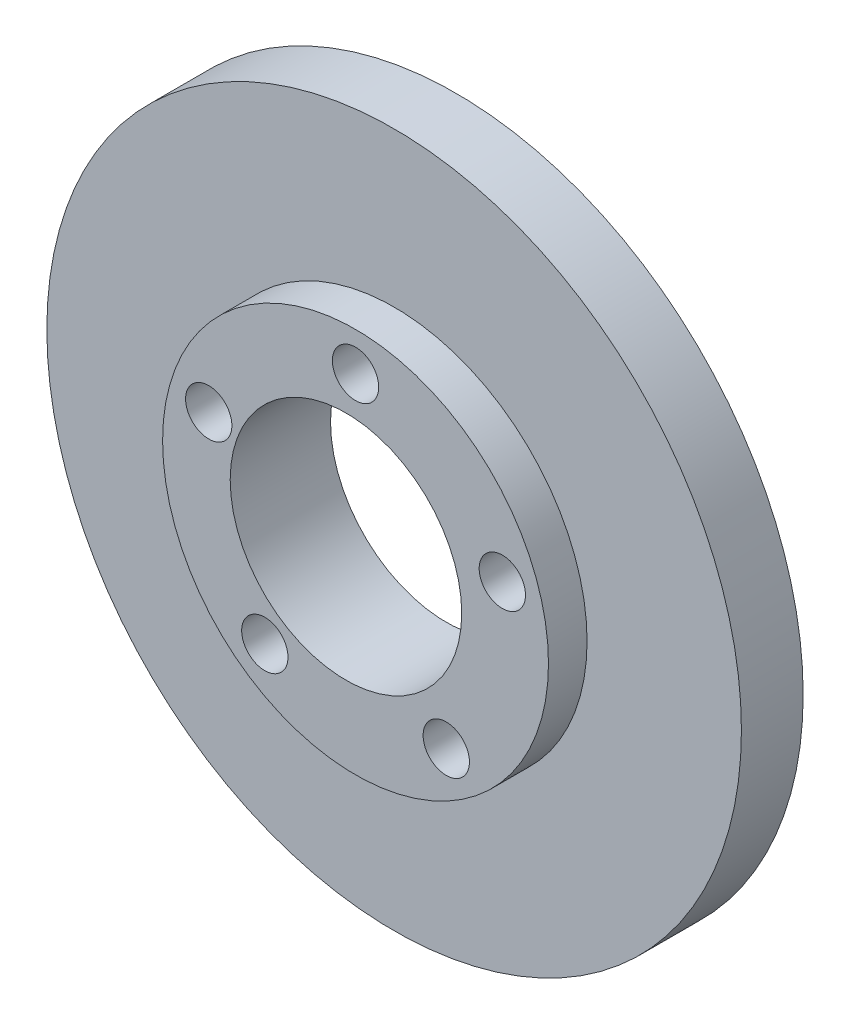
ISO-10303-21;
HEADER;
FILE_DESCRIPTION(('STEP AP214'),'2;1');
FILE_NAME('part.step','',(''),(''),'','','');
FILE_SCHEMA(('AUTOMOTIVE_DESIGN { 1 0 10303 214 1 1 1 1 }'));
ENDSEC;
DATA;
#1=APPLICATION_CONTEXT('core data for automotive mechanical design processes');
#2=APPLICATION_PROTOCOL_DEFINITION('international standard','automotive_design',2000,#1);
#3=PRODUCT_CONTEXT('',#1,'mechanical');
#4=PRODUCT('Part','Part','',(#3));
#5=PRODUCT_RELATED_PRODUCT_CATEGORY('part','',(#4));
#6=PRODUCT_DEFINITION_FORMATION('','',#4);
#7=PRODUCT_DEFINITION_CONTEXT('part definition',#1,'design');
#8=PRODUCT_DEFINITION('design','',#6,#7);
#9=PRODUCT_DEFINITION_SHAPE('','',#8);
#10=(LENGTH_UNIT() NAMED_UNIT(*) SI_UNIT(.MILLI.,.METRE.));
#11=(NAMED_UNIT(*) PLANE_ANGLE_UNIT() SI_UNIT($,.RADIAN.));
#12=(NAMED_UNIT(*) SI_UNIT($,.STERADIAN.) SOLID_ANGLE_UNIT());
#13=UNCERTAINTY_MEASURE_WITH_UNIT(LENGTH_MEASURE(1.E-05),#10,'distance_accuracy_value','');
#14=(GEOMETRIC_REPRESENTATION_CONTEXT(3) GLOBAL_UNCERTAINTY_ASSIGNED_CONTEXT((#13)) GLOBAL_UNIT_ASSIGNED_CONTEXT((#10,
#11,#12)) REPRESENTATION_CONTEXT('',''));
#15=CARTESIAN_POINT('',(0.,0.,0.));
#16=DIRECTION('',(0.,0.,1.));
#17=DIRECTION('',(1.,0.,0.));
#18=AXIS2_PLACEMENT_3D('',#15,#16,#17);
#19=CARTESIAN_POINT('',(0.,0.,8.));
#20=DIRECTION('',(0.,0.,1.));
#21=DIRECTION('',(1.,0.,0.));
#22=AXIS2_PLACEMENT_3D('',#19,#20,#21);
#23=PLANE('',#22);
#24=CARTESIAN_POINT('',(0.,0.,8.));
#25=DIRECTION('',(0.,0.,1.));
#26=DIRECTION('',(1.,0.,0.));
#27=AXIS2_PLACEMENT_3D('',#24,#25,#26);
#28=CIRCLE('',#27,90.);
#29=CARTESIAN_POINT('',(90.,0.,8.));
#30=VERTEX_POINT('',#29);
#31=EDGE_CURVE('E10',#30,#30,#28,.T.);
#32=ORIENTED_EDGE('',*,*,#31,.T.);
#33=EDGE_LOOP('',(#32));
#34=FACE_BOUND('',#33,.T.);
#35=CARTESIAN_POINT('',(0.,0.,8.));
#36=DIRECTION('',(0.,0.,1.));
#37=DIRECTION('',(1.,0.,0.));
#38=AXIS2_PLACEMENT_3D('',#35,#36,#37);
#39=CIRCLE('',#38,50.);
#40=CARTESIAN_POINT('',(50.,0.,8.));
#41=VERTEX_POINT('',#40);
#42=EDGE_CURVE('E56',#41,#41,#39,.T.);
#43=ORIENTED_EDGE('',*,*,#42,.F.);
#44=EDGE_LOOP('',(#43));
#45=FACE_BOUND('',#44,.T.);
#46=ADVANCED_FACE('F37',(#34,#45),#23,.T.);
#47=CARTESIAN_POINT('',(0.,0.,-8.));
#48=DIRECTION('',(0.,0.,1.));
#49=DIRECTION('',(1.,0.,0.));
#50=AXIS2_PLACEMENT_3D('',#47,#48,#49);
#51=PLANE('',#50);
#52=CARTESIAN_POINT('',(0.,40.,-8.));
#53=DIRECTION('',(0.,0.,1.));
#54=DIRECTION('',(1.,0.,0.));
#55=AXIS2_PLACEMENT_3D('',#52,#53,#54);
#56=CIRCLE('',#55,6.);
#57=CARTESIAN_POINT('',(6.,40.,-8.));
#58=VERTEX_POINT('',#57);
#59=EDGE_CURVE('E99',#58,#58,#56,.T.);
#60=ORIENTED_EDGE('',*,*,#59,.T.);
#61=EDGE_LOOP('',(#60));
#62=FACE_BOUND('',#61,.T.);
#63=CARTESIAN_POINT('',(-38.042260651805,12.3606797749963,-8.));
#64=DIRECTION('',(0.,0.,1.));
#65=DIRECTION('',(1.,0.,0.));
#66=AXIS2_PLACEMENT_3D('',#63,#64,#65);
#67=CIRCLE('',#66,6.);
#68=CARTESIAN_POINT('',(-32.042260651805,12.3606797749963,-8.));
#69=VERTEX_POINT('',#68);
#70=EDGE_CURVE('E91',#69,#69,#67,.T.);
#71=ORIENTED_EDGE('',*,*,#70,.T.);
#72=EDGE_LOOP('',(#71));
#73=FACE_BOUND('',#72,.T.);
#74=CARTESIAN_POINT('',(-23.5114100916959,-32.3606797749989,-8.));
#75=DIRECTION('',(0.,0.,1.));
#76=DIRECTION('',(1.,0.,0.));
#77=AXIS2_PLACEMENT_3D('',#74,#75,#76);
#78=CIRCLE('',#77,5.99999999999999);
#79=CARTESIAN_POINT('',(-17.5114100916959,-32.3606797749989,-8.));
#80=VERTEX_POINT('',#79);
#81=EDGE_CURVE('E83',#80,#80,#78,.T.);
#82=ORIENTED_EDGE('',*,*,#81,.T.);
#83=EDGE_LOOP('',(#82));
#84=FACE_BOUND('',#83,.T.);
#85=CARTESIAN_POINT('',(23.511410091702,-32.3606797749969,-8.));
#86=DIRECTION('',(0.,0.,1.));
#87=DIRECTION('',(1.,0.,0.));
#88=AXIS2_PLACEMENT_3D('',#85,#86,#87);
#89=CIRCLE('',#88,5.99999999999999);
#90=CARTESIAN_POINT('',(29.511410091702,-32.3606797749969,-8.));
#91=VERTEX_POINT('',#90);
#92=EDGE_CURVE('E75',#91,#91,#89,.T.);
#93=ORIENTED_EDGE('',*,*,#92,.T.);
#94=EDGE_LOOP('',(#93));
#95=FACE_BOUND('',#94,.T.);
#96=CARTESIAN_POINT('',(38.0422606518073,12.3606797749995,-8.));
#97=DIRECTION('',(0.,0.,1.));
#98=DIRECTION('',(1.,0.,0.));
#99=AXIS2_PLACEMENT_3D('',#96,#97,#98);
#100=CIRCLE('',#99,6.);
#101=CARTESIAN_POINT('',(44.0422606518073,12.3606797749995,-8.));
#102=VERTEX_POINT('',#101);
#103=EDGE_CURVE('E67',#102,#102,#100,.T.);
#104=ORIENTED_EDGE('',*,*,#103,.T.);
#105=EDGE_LOOP('',(#104));
#106=FACE_BOUND('',#105,.T.);
#107=CARTESIAN_POINT('',(0.,0.,-8.));
#108=DIRECTION('',(0.,0.,1.));
#109=DIRECTION('',(1.,0.,0.));
#110=AXIS2_PLACEMENT_3D('',#107,#108,#109);
#111=CIRCLE('',#110,90.);
#112=CARTESIAN_POINT('',(90.,0.,-8.));
#113=VERTEX_POINT('',#112);
#114=EDGE_CURVE('E41',#113,#113,#111,.T.);
#115=ORIENTED_EDGE('',*,*,#114,.F.);
#116=EDGE_LOOP('',(#115));
#117=FACE_BOUND('',#116,.T.);
#118=CARTESIAN_POINT('',(-2.48179972539031,0.,-8.));
#119=DIRECTION('',(0.,0.,1.));
#120=DIRECTION('',(1.,0.,0.));
#121=AXIS2_PLACEMENT_3D('',#118,#119,#120);
#122=CIRCLE('',#121,30.);
#123=CARTESIAN_POINT('',(27.5182002746097,0.,-8.));
#124=VERTEX_POINT('',#123);
#125=EDGE_CURVE('E50',#124,#124,#122,.T.);
#126=ORIENTED_EDGE('',*,*,#125,.T.);
#127=EDGE_LOOP('',(#126));
#128=FACE_BOUND('',#127,.T.);
#129=ADVANCED_FACE('F134',(#62,#73,#84,#95,#106,#117,#128),#51,.F.);
#130=CARTESIAN_POINT('',(0.,0.,8.));
#131=DIRECTION('',(0.,0.,-1.));
#132=DIRECTION('',(-1.,0.,0.));
#133=AXIS2_PLACEMENT_3D('',#130,#131,#132);
#134=CYLINDRICAL_SURFACE('',#133,90.);
#135=ORIENTED_EDGE('',*,*,#31,.F.);
#136=EDGE_LOOP('',(#135));
#137=FACE_BOUND('',#136,.T.);
#138=ORIENTED_EDGE('',*,*,#114,.T.);
#139=EDGE_LOOP('',(#138));
#140=FACE_BOUND('',#139,.T.);
#141=ADVANCED_FACE('F39',(#137,#140),#134,.T.);
#142=CARTESIAN_POINT('',(-2.48179972539031,0.,8.));
#143=DIRECTION('',(0.,0.,-1.));
#144=DIRECTION('',(-1.,0.,0.));
#145=AXIS2_PLACEMENT_3D('',#142,#143,#144);
#146=CYLINDRICAL_SURFACE('',#145,30.);
#147=ORIENTED_EDGE('',*,*,#125,.F.);
#148=EDGE_LOOP('',(#147));
#149=FACE_BOUND('',#148,.T.);
#150=CARTESIAN_POINT('',(-2.48179972539031,0.,18.));
#151=DIRECTION('',(0.,0.,1.));
#152=DIRECTION('',(1.,0.,0.));
#153=AXIS2_PLACEMENT_3D('',#150,#151,#152);
#154=CIRCLE('',#153,30.);
#155=CARTESIAN_POINT('',(27.5182002746097,0.,18.));
#156=VERTEX_POINT('',#155);
#157=EDGE_CURVE('E60',#156,#156,#154,.T.);
#158=ORIENTED_EDGE('',*,*,#157,.T.);
#159=EDGE_LOOP('',(#158));
#160=FACE_BOUND('',#159,.T.);
#161=ADVANCED_FACE('F114',(#149,#160),#146,.F.);
#162=CARTESIAN_POINT('',(0.,0.,18.));
#163=DIRECTION('',(0.,0.,1.));
#164=DIRECTION('',(1.,0.,0.));
#165=AXIS2_PLACEMENT_3D('',#162,#163,#164);
#166=PLANE('',#165);
#167=CARTESIAN_POINT('',(0.,40.,18.));
#168=DIRECTION('',(0.,0.,1.));
#169=DIRECTION('',(1.,0.,0.));
#170=AXIS2_PLACEMENT_3D('',#167,#168,#169);
#171=CIRCLE('',#170,5.99999999999999);
#172=CARTESIAN_POINT('',(5.99999999999999,40.,18.));
#173=VERTEX_POINT('',#172);
#174=EDGE_CURVE('E103',#173,#173,#171,.T.);
#175=ORIENTED_EDGE('',*,*,#174,.F.);
#176=EDGE_LOOP('',(#175));
#177=FACE_BOUND('',#176,.T.);
#178=CARTESIAN_POINT('',(-38.042260651805,12.3606797749963,18.));
#179=DIRECTION('',(0.,0.,1.));
#180=DIRECTION('',(1.,0.,0.));
#181=AXIS2_PLACEMENT_3D('',#178,#179,#180);
#182=CIRCLE('',#181,5.99999999999998);
#183=CARTESIAN_POINT('',(-32.042260651805,12.3606797749963,18.));
#184=VERTEX_POINT('',#183);
#185=EDGE_CURVE('E95',#184,#184,#182,.T.);
#186=ORIENTED_EDGE('',*,*,#185,.F.);
#187=EDGE_LOOP('',(#186));
#188=FACE_BOUND('',#187,.T.);
#189=CARTESIAN_POINT('',(-23.5114100916959,-32.3606797749989,18.));
#190=DIRECTION('',(0.,0.,1.));
#191=DIRECTION('',(1.,0.,0.));
#192=AXIS2_PLACEMENT_3D('',#189,#190,#191);
#193=CIRCLE('',#192,5.99999999999999);
#194=CARTESIAN_POINT('',(-17.5114100916959,-32.3606797749989,18.));
#195=VERTEX_POINT('',#194);
#196=EDGE_CURVE('E87',#195,#195,#193,.T.);
#197=ORIENTED_EDGE('',*,*,#196,.F.);
#198=EDGE_LOOP('',(#197));
#199=FACE_BOUND('',#198,.T.);
#200=CARTESIAN_POINT('',(23.511410091702,-32.3606797749969,18.));
#201=DIRECTION('',(0.,0.,1.));
#202=DIRECTION('',(1.,0.,0.));
#203=AXIS2_PLACEMENT_3D('',#200,#201,#202);
#204=CIRCLE('',#203,5.99999999999999);
#205=CARTESIAN_POINT('',(29.511410091702,-32.3606797749969,18.));
#206=VERTEX_POINT('',#205);
#207=EDGE_CURVE('E79',#206,#206,#204,.T.);
#208=ORIENTED_EDGE('',*,*,#207,.F.);
#209=EDGE_LOOP('',(#208));
#210=FACE_BOUND('',#209,.T.);
#211=CARTESIAN_POINT('',(38.0422606518073,12.3606797749995,18.));
#212=DIRECTION('',(0.,0.,1.));
#213=DIRECTION('',(1.,0.,0.));
#214=AXIS2_PLACEMENT_3D('',#211,#212,#213);
#215=CIRCLE('',#214,5.99999999999998);
#216=CARTESIAN_POINT('',(44.0422606518073,12.3606797749995,18.));
#217=VERTEX_POINT('',#216);
#218=EDGE_CURVE('E71',#217,#217,#215,.T.);
#219=ORIENTED_EDGE('',*,*,#218,.F.);
#220=EDGE_LOOP('',(#219));
#221=FACE_BOUND('',#220,.T.);
#222=CARTESIAN_POINT('',(0.,0.,18.));
#223=DIRECTION('',(0.,0.,1.));
#224=DIRECTION('',(1.,0.,0.));
#225=AXIS2_PLACEMENT_3D('',#222,#223,#224);
#226=CIRCLE('',#225,50.);
#227=CARTESIAN_POINT('',(50.,0.,18.));
#228=VERTEX_POINT('',#227);
#229=EDGE_CURVE('E55',#228,#228,#226,.T.);
#230=ORIENTED_EDGE('',*,*,#229,.T.);
#231=EDGE_LOOP('',(#230));
#232=FACE_BOUND('',#231,.T.);
#233=ORIENTED_EDGE('',*,*,#157,.F.);
#234=EDGE_LOOP('',(#233));
#235=FACE_BOUND('',#234,.T.);
#236=ADVANCED_FACE('F110',(#177,#188,#199,#210,#221,#232,#235),#166,.T.);
#237=CARTESIAN_POINT('',(0.,0.,18.));
#238=DIRECTION('',(0.,0.,-1.));
#239=DIRECTION('',(-1.,0.,0.));
#240=AXIS2_PLACEMENT_3D('',#237,#238,#239);
#241=CYLINDRICAL_SURFACE('',#240,50.);
#242=ORIENTED_EDGE('',*,*,#229,.F.);
#243=EDGE_LOOP('',(#242));
#244=FACE_BOUND('',#243,.T.);
#245=ORIENTED_EDGE('',*,*,#42,.T.);
#246=EDGE_LOOP('',(#245));
#247=FACE_BOUND('',#246,.T.);
#248=ADVANCED_FACE('F113',(#244,#247),#241,.T.);
#249=CARTESIAN_POINT('',(38.0422606518073,12.3606797749995,18.));
#250=DIRECTION('',(0.,0.,1.));
#251=DIRECTION('',(1.,0.,0.));
#252=AXIS2_PLACEMENT_3D('',#249,#250,#251);
#253=CYLINDRICAL_SURFACE('',#252,5.99999999999999);
#254=ORIENTED_EDGE('',*,*,#103,.F.);
#255=EDGE_LOOP('',(#254));
#256=FACE_BOUND('',#255,.T.);
#257=ORIENTED_EDGE('',*,*,#218,.T.);
#258=EDGE_LOOP('',(#257));
#259=FACE_BOUND('',#258,.T.);
#260=ADVANCED_FACE('F148',(#256,#259),#253,.F.);
#261=CARTESIAN_POINT('',(23.511410091702,-32.3606797749969,18.));
#262=DIRECTION('',(0.,0.,1.));
#263=DIRECTION('',(1.,0.,0.));
#264=AXIS2_PLACEMENT_3D('',#261,#262,#263);
#265=CYLINDRICAL_SURFACE('',#264,5.99999999999999);
#266=ORIENTED_EDGE('',*,*,#92,.F.);
#267=EDGE_LOOP('',(#266));
#268=FACE_BOUND('',#267,.T.);
#269=ORIENTED_EDGE('',*,*,#207,.T.);
#270=EDGE_LOOP('',(#269));
#271=FACE_BOUND('',#270,.T.);
#272=ADVANCED_FACE('F153',(#268,#271),#265,.F.);
#273=CARTESIAN_POINT('',(-23.5114100916959,-32.3606797749989,18.));
#274=DIRECTION('',(0.,0.,1.));
#275=DIRECTION('',(1.,0.,0.));
#276=AXIS2_PLACEMENT_3D('',#273,#274,#275);
#277=CYLINDRICAL_SURFACE('',#276,5.99999999999999);
#278=ORIENTED_EDGE('',*,*,#81,.F.);
#279=EDGE_LOOP('',(#278));
#280=FACE_BOUND('',#279,.T.);
#281=ORIENTED_EDGE('',*,*,#196,.T.);
#282=EDGE_LOOP('',(#281));
#283=FACE_BOUND('',#282,.T.);
#284=ADVANCED_FACE('F159',(#280,#283),#277,.F.);
#285=CARTESIAN_POINT('',(-38.042260651805,12.3606797749963,18.));
#286=DIRECTION('',(0.,0.,1.));
#287=DIRECTION('',(1.,0.,0.));
#288=AXIS2_PLACEMENT_3D('',#285,#286,#287);
#289=CYLINDRICAL_SURFACE('',#288,5.99999999999999);
#290=ORIENTED_EDGE('',*,*,#70,.F.);
#291=EDGE_LOOP('',(#290));
#292=FACE_BOUND('',#291,.T.);
#293=ORIENTED_EDGE('',*,*,#185,.T.);
#294=EDGE_LOOP('',(#293));
#295=FACE_BOUND('',#294,.T.);
#296=ADVANCED_FACE('F163',(#292,#295),#289,.F.);
#297=CARTESIAN_POINT('',(0.,40.,18.));
#298=DIRECTION('',(0.,0.,1.));
#299=DIRECTION('',(1.,0.,0.));
#300=AXIS2_PLACEMENT_3D('',#297,#298,#299);
#301=CYLINDRICAL_SURFACE('',#300,5.99999999999999);
#302=ORIENTED_EDGE('',*,*,#59,.F.);
#303=EDGE_LOOP('',(#302));
#304=FACE_BOUND('',#303,.T.);
#305=ORIENTED_EDGE('',*,*,#174,.T.);
#306=EDGE_LOOP('',(#305));
#307=FACE_BOUND('',#306,.T.);
#308=ADVANCED_FACE('F108',(#304,#307),#301,.F.);
#309=CLOSED_SHELL('',(#46,#129,#141,#161,#236,#248,#260,#272,#284,#296,#308));
#310=MANIFOLD_SOLID_BREP('B2',#309);
#311=ADVANCED_BREP_SHAPE_REPRESENTATION('',(#18,#310),#14);
#312=SHAPE_DEFINITION_REPRESENTATION(#9,#311);
ENDSEC;
END-ISO-10303-21;
